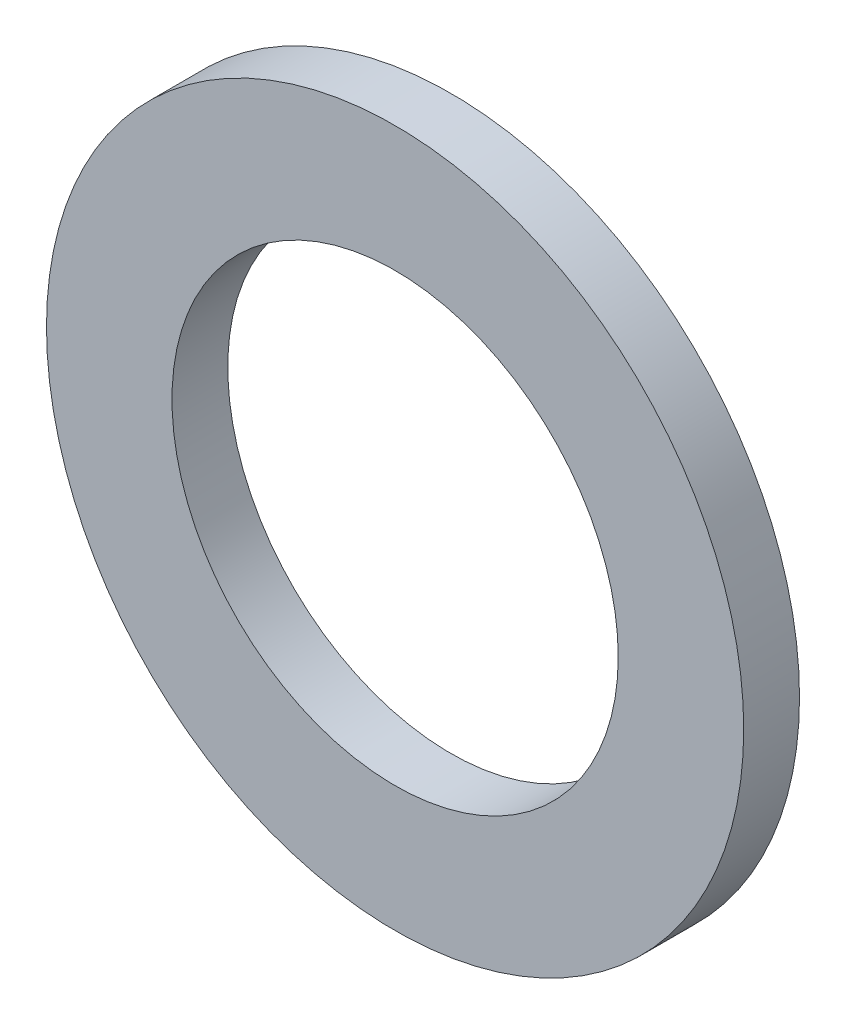
ISO-10303-21;
HEADER;
FILE_DESCRIPTION(('STEP AP214'),'2;1');
FILE_NAME('part.step','',(''),(''),'','','');
FILE_SCHEMA(('AUTOMOTIVE_DESIGN { 1 0 10303 214 1 1 1 1 }'));
ENDSEC;
DATA;
#1=APPLICATION_CONTEXT('core data for automotive mechanical design processes');
#2=APPLICATION_PROTOCOL_DEFINITION('international standard','automotive_design',2000,#1);
#3=PRODUCT_CONTEXT('',#1,'mechanical');
#4=PRODUCT('Part','Part','',(#3));
#5=PRODUCT_RELATED_PRODUCT_CATEGORY('part','',(#4));
#6=PRODUCT_DEFINITION_FORMATION('','',#4);
#7=PRODUCT_DEFINITION_CONTEXT('part definition',#1,'design');
#8=PRODUCT_DEFINITION('design','',#6,#7);
#9=PRODUCT_DEFINITION_SHAPE('','',#8);
#10=(LENGTH_UNIT() NAMED_UNIT(*) SI_UNIT(.MILLI.,.METRE.));
#11=(NAMED_UNIT(*) PLANE_ANGLE_UNIT() SI_UNIT($,.RADIAN.));
#12=(NAMED_UNIT(*) SI_UNIT($,.STERADIAN.) SOLID_ANGLE_UNIT());
#13=UNCERTAINTY_MEASURE_WITH_UNIT(LENGTH_MEASURE(1.E-05),#10,'distance_accuracy_value','');
#14=(GEOMETRIC_REPRESENTATION_CONTEXT(3) GLOBAL_UNCERTAINTY_ASSIGNED_CONTEXT((#13)) GLOBAL_UNIT_ASSIGNED_CONTEXT((#10,
#11,#12)) REPRESENTATION_CONTEXT('',''));
#15=CARTESIAN_POINT('',(0.,0.,0.));
#16=DIRECTION('',(0.,0.,1.));
#17=DIRECTION('',(1.,0.,0.));
#18=AXIS2_PLACEMENT_3D('',#15,#16,#17);
#19=CARTESIAN_POINT('',(0.,0.,3.175));
#20=DIRECTION('',(0.,0.,1.));
#21=DIRECTION('',(1.,0.,0.));
#22=AXIS2_PLACEMENT_3D('',#19,#20,#21);
#23=PLANE('',#22);
#24=CARTESIAN_POINT('',(0.,0.,3.175));
#25=DIRECTION('',(0.,0.,1.));
#26=DIRECTION('',(1.,0.,0.));
#27=AXIS2_PLACEMENT_3D('',#24,#25,#26);
#28=CIRCLE('',#27,19.84375);
#29=CARTESIAN_POINT('',(19.84375,0.,3.175));
#30=VERTEX_POINT('',#29);
#31=EDGE_CURVE('E10',#30,#30,#28,.T.);
#32=ORIENTED_EDGE('',*,*,#31,.T.);
#33=EDGE_LOOP('',(#32));
#34=FACE_BOUND('',#33,.T.);
#35=CARTESIAN_POINT('',(0.,0.,3.175));
#36=DIRECTION('',(0.,0.,1.));
#37=DIRECTION('',(1.,0.,0.));
#38=AXIS2_PLACEMENT_3D('',#35,#36,#37);
#39=CIRCLE('',#38,12.7);
#40=CARTESIAN_POINT('',(12.7,0.,3.175));
#41=VERTEX_POINT('',#40);
#42=EDGE_CURVE('E48',#41,#41,#39,.T.);
#43=ORIENTED_EDGE('',*,*,#42,.F.);
#44=EDGE_LOOP('',(#43));
#45=FACE_BOUND('',#44,.T.);
#46=ADVANCED_FACE('F37',(#34,#45),#23,.T.);
#47=CARTESIAN_POINT('',(0.,0.,0.));
#48=DIRECTION('',(0.,0.,1.));
#49=DIRECTION('',(1.,0.,0.));
#50=AXIS2_PLACEMENT_3D('',#47,#48,#49);
#51=PLANE('',#50);
#52=CARTESIAN_POINT('',(0.,0.,0.));
#53=DIRECTION('',(0.,0.,1.));
#54=DIRECTION('',(1.,0.,0.));
#55=AXIS2_PLACEMENT_3D('',#52,#53,#54);
#56=CIRCLE('',#55,19.84375);
#57=CARTESIAN_POINT('',(19.84375,0.,0.));
#58=VERTEX_POINT('',#57);
#59=EDGE_CURVE('E41',#58,#58,#56,.T.);
#60=ORIENTED_EDGE('',*,*,#59,.F.);
#61=EDGE_LOOP('',(#60));
#62=FACE_BOUND('',#61,.T.);
#63=CARTESIAN_POINT('',(0.,0.,0.));
#64=DIRECTION('',(0.,0.,1.));
#65=DIRECTION('',(1.,0.,0.));
#66=AXIS2_PLACEMENT_3D('',#63,#64,#65);
#67=CIRCLE('',#66,12.7);
#68=CARTESIAN_POINT('',(12.7,0.,0.));
#69=VERTEX_POINT('',#68);
#70=EDGE_CURVE('E50',#69,#69,#67,.T.);
#71=ORIENTED_EDGE('',*,*,#70,.T.);
#72=EDGE_LOOP('',(#71));
#73=FACE_BOUND('',#72,.T.);
#74=ADVANCED_FACE('F60',(#62,#73),#51,.F.);
#75=CARTESIAN_POINT('',(0.,0.,3.175));
#76=DIRECTION('',(0.,0.,-1.));
#77=DIRECTION('',(-1.,0.,0.));
#78=AXIS2_PLACEMENT_3D('',#75,#76,#77);
#79=CYLINDRICAL_SURFACE('',#78,19.84375);
#80=ORIENTED_EDGE('',*,*,#31,.F.);
#81=EDGE_LOOP('',(#80));
#82=FACE_BOUND('',#81,.T.);
#83=ORIENTED_EDGE('',*,*,#59,.T.);
#84=EDGE_LOOP('',(#83));
#85=FACE_BOUND('',#84,.T.);
#86=ADVANCED_FACE('F39',(#82,#85),#79,.T.);
#87=CARTESIAN_POINT('',(0.,0.,3.175));
#88=DIRECTION('',(0.,0.,-1.));
#89=DIRECTION('',(-1.,0.,0.));
#90=AXIS2_PLACEMENT_3D('',#87,#88,#89);
#91=CYLINDRICAL_SURFACE('',#90,12.7);
#92=ORIENTED_EDGE('',*,*,#42,.T.);
#93=EDGE_LOOP('',(#92));
#94=FACE_BOUND('',#93,.T.);
#95=ORIENTED_EDGE('',*,*,#70,.F.);
#96=EDGE_LOOP('',(#95));
#97=FACE_BOUND('',#96,.T.);
#98=ADVANCED_FACE('F56',(#94,#97),#91,.F.);
#99=CLOSED_SHELL('',(#46,#74,#86,#98));
#100=MANIFOLD_SOLID_BREP('B2',#99);
#101=ADVANCED_BREP_SHAPE_REPRESENTATION('',(#18,#100),#14);
#102=SHAPE_DEFINITION_REPRESENTATION(#9,#101);
ENDSEC;
END-ISO-10303-21;
